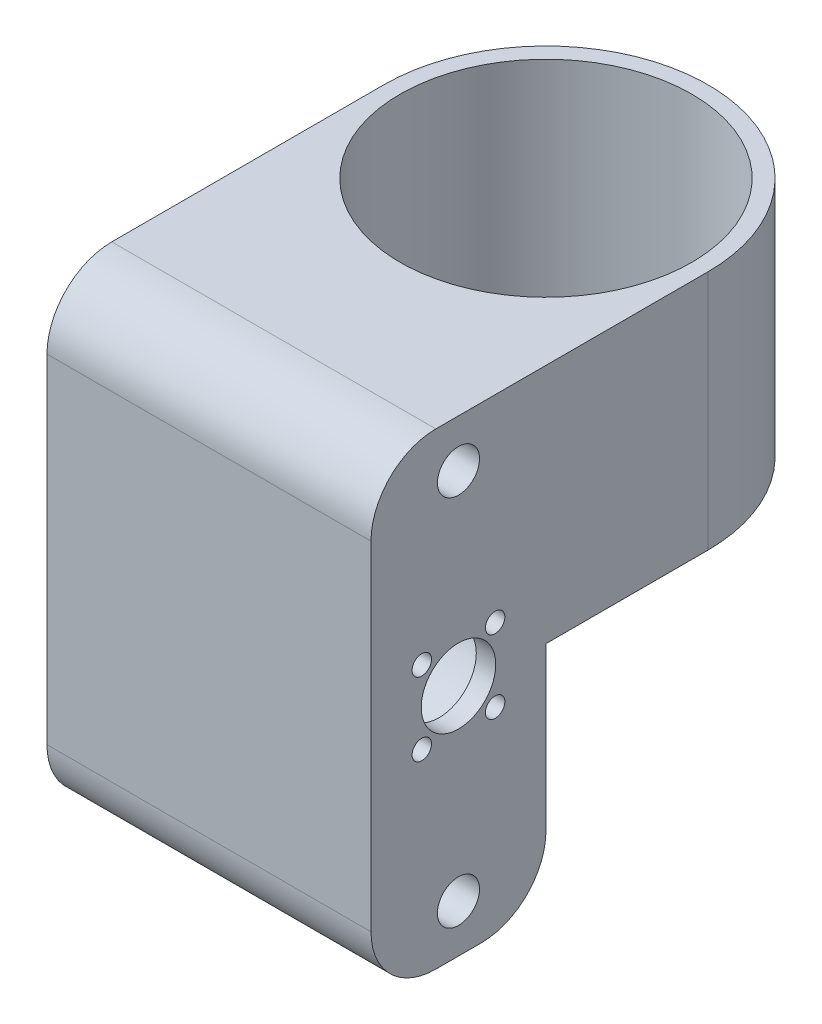
ISO-10303-21;
HEADER;
FILE_DESCRIPTION(('STEP AP214'),'2;1');
FILE_NAME('part.step','',(''),(''),'','','');
FILE_SCHEMA(('AUTOMOTIVE_DESIGN { 1 0 10303 214 1 1 1 1 }'));
ENDSEC;
DATA;
#1=APPLICATION_CONTEXT('core data for automotive mechanical design processes');
#2=APPLICATION_PROTOCOL_DEFINITION('international standard','automotive_design',2000,#1);
#3=PRODUCT_CONTEXT('',#1,'mechanical');
#4=PRODUCT('Part','Part','',(#3));
#5=PRODUCT_RELATED_PRODUCT_CATEGORY('part','',(#4));
#6=PRODUCT_DEFINITION_FORMATION('','',#4);
#7=PRODUCT_DEFINITION_CONTEXT('part definition',#1,'design');
#8=PRODUCT_DEFINITION('design','',#6,#7);
#9=PRODUCT_DEFINITION_SHAPE('','',#8);
#10=(LENGTH_UNIT() NAMED_UNIT(*) SI_UNIT(.MILLI.,.METRE.));
#11=(NAMED_UNIT(*) PLANE_ANGLE_UNIT() SI_UNIT($,.RADIAN.));
#12=(NAMED_UNIT(*) SI_UNIT($,.STERADIAN.) SOLID_ANGLE_UNIT());
#13=UNCERTAINTY_MEASURE_WITH_UNIT(LENGTH_MEASURE(1.E-05),#10,'distance_accuracy_value','');
#14=(GEOMETRIC_REPRESENTATION_CONTEXT(3) GLOBAL_UNCERTAINTY_ASSIGNED_CONTEXT((#13)) GLOBAL_UNIT_ASSIGNED_CONTEXT((#10,
#11,#12)) REPRESENTATION_CONTEXT('',''));
#15=CARTESIAN_POINT('',(0.,0.,0.));
#16=DIRECTION('',(0.,0.,1.));
#17=DIRECTION('',(1.,0.,0.));
#18=AXIS2_PLACEMENT_3D('',#15,#16,#17);
#19=CARTESIAN_POINT('',(25.,99.7396103067893,-38.5));
#20=DIRECTION('',(0.,-1.,0.));
#21=DIRECTION('',(0.,0.,-1.));
#22=AXIS2_PLACEMENT_3D('',#19,#20,#21);
#23=CYLINDRICAL_SURFACE('',#22,22.5);
#24=CARTESIAN_POINT('',(25.,36.1,-38.5));
#25=DIRECTION('',(0.,-1.,0.));
#26=DIRECTION('',(0.,0.,-1.));
#27=AXIS2_PLACEMENT_3D('',#24,#25,#26);
#28=CIRCLE('',#27,22.5);
#29=CARTESIAN_POINT('',(25.,36.1,-61.));
#30=VERTEX_POINT('',#29);
#31=EDGE_CURVE('E244',#30,#30,#28,.F.);
#32=CARTESIAN_POINT('',(25.,3.9,-38.5));
#33=DIRECTION('',(0.,-1.,0.));
#34=DIRECTION('',(0.,0.,-1.));
#35=AXIS2_PLACEMENT_3D('',#32,#33,#34);
#36=CIRCLE('',#35,22.5);
#37=CARTESIAN_POINT('',(25.,3.9,-61.));
#38=VERTEX_POINT('',#37);
#39=EDGE_CURVE('E180',#38,#38,#36,.F.);
#40=CARTESIAN_POINT('',(25.,36.1,-61.));
#41=CARTESIAN_POINT('',(25.,35.7645833333333,-61.));
#42=CARTESIAN_POINT('',(25.,35.4291666666667,-61.));
#43=CARTESIAN_POINT('',(25.,34.7583333333333,-61.));
#44=CARTESIAN_POINT('',(25.,34.4229166666667,-61.));
#45=CARTESIAN_POINT('',(25.,33.7520833333333,-61.));
#46=CARTESIAN_POINT('',(25.,33.4166666666667,-61.));
#47=CARTESIAN_POINT('',(25.,32.7458333333333,-61.));
#48=CARTESIAN_POINT('',(25.,32.4104166666667,-61.));
#49=CARTESIAN_POINT('',(25.,31.7395833333333,-61.));
#50=CARTESIAN_POINT('',(25.,31.4041666666667,-61.));
#51=CARTESIAN_POINT('',(25.,30.7333333333333,-61.));
#52=CARTESIAN_POINT('',(25.,30.3979166666667,-61.));
#53=CARTESIAN_POINT('',(25.,29.7270833333333,-61.));
#54=CARTESIAN_POINT('',(25.,29.3916666666667,-61.));
#55=CARTESIAN_POINT('',(25.,28.7208333333333,-61.));
#56=CARTESIAN_POINT('',(25.,28.3854166666667,-61.));
#57=CARTESIAN_POINT('',(25.,27.7145833333333,-61.));
#58=CARTESIAN_POINT('',(25.,27.3791666666667,-61.));
#59=CARTESIAN_POINT('',(25.,26.7083333333333,-61.));
#60=CARTESIAN_POINT('',(25.,26.3729166666667,-61.));
#61=CARTESIAN_POINT('',(25.,25.7020833333333,-61.));
#62=CARTESIAN_POINT('',(25.,25.3666666666667,-61.));
#63=CARTESIAN_POINT('',(25.,24.6958333333333,-61.));
#64=CARTESIAN_POINT('',(25.,24.3604166666667,-61.));
#65=CARTESIAN_POINT('',(25.,23.6895833333333,-61.));
#66=CARTESIAN_POINT('',(25.,23.3541666666667,-61.));
#67=CARTESIAN_POINT('',(25.,22.6833333333333,-61.));
#68=CARTESIAN_POINT('',(25.,22.3479166666667,-61.));
#69=CARTESIAN_POINT('',(25.,21.6770833333333,-61.));
#70=CARTESIAN_POINT('',(25.,21.3416666666667,-61.));
#71=CARTESIAN_POINT('',(25.,20.6708333333333,-61.));
#72=CARTESIAN_POINT('',(25.,20.3354166666667,-61.));
#73=CARTESIAN_POINT('',(25.,19.6645833333333,-61.));
#74=CARTESIAN_POINT('',(25.,19.3291666666667,-61.));
#75=CARTESIAN_POINT('',(25.,18.6583333333333,-61.));
#76=CARTESIAN_POINT('',(25.,18.3229166666667,-61.));
#77=CARTESIAN_POINT('',(25.,17.6520833333333,-61.));
#78=CARTESIAN_POINT('',(25.,17.3166666666667,-61.));
#79=CARTESIAN_POINT('',(25.,16.6458333333333,-61.));
#80=CARTESIAN_POINT('',(25.,16.3104166666667,-61.));
#81=CARTESIAN_POINT('',(25.,15.6395833333333,-61.));
#82=CARTESIAN_POINT('',(25.,15.3041666666667,-61.));
#83=CARTESIAN_POINT('',(25.,14.6333333333333,-61.));
#84=CARTESIAN_POINT('',(25.,14.2979166666667,-61.));
#85=CARTESIAN_POINT('',(25.,13.6270833333333,-61.));
#86=CARTESIAN_POINT('',(25.,13.2916666666667,-61.));
#87=CARTESIAN_POINT('',(25.,12.6208333333333,-61.));
#88=CARTESIAN_POINT('',(25.,12.2854166666667,-61.));
#89=CARTESIAN_POINT('',(25.,11.6145833333333,-61.));
#90=CARTESIAN_POINT('',(25.,11.2791666666667,-61.));
#91=CARTESIAN_POINT('',(25.,10.6083333333333,-61.));
#92=CARTESIAN_POINT('',(25.,10.2729166666667,-61.));
#93=CARTESIAN_POINT('',(25.,9.60208333333334,-61.));
#94=CARTESIAN_POINT('',(25.,9.26666666666667,-61.));
#95=CARTESIAN_POINT('',(25.,8.59583333333333,-61.));
#96=CARTESIAN_POINT('',(25.,8.26041666666667,-61.));
#97=CARTESIAN_POINT('',(25.,7.58958333333333,-61.));
#98=CARTESIAN_POINT('',(25.,7.25416666666667,-61.));
#99=CARTESIAN_POINT('',(25.,6.58333333333333,-61.));
#100=CARTESIAN_POINT('',(25.,6.24791666666667,-61.));
#101=CARTESIAN_POINT('',(25.,5.57708333333333,-61.));
#102=CARTESIAN_POINT('',(25.,5.24166666666667,-61.));
#103=CARTESIAN_POINT('',(25.,4.57083333333333,-61.));
#104=CARTESIAN_POINT('',(25.,4.23541666666667,-61.));
#105=CARTESIAN_POINT('',(25.,3.9,-61.));
#106=B_SPLINE_CURVE_WITH_KNOTS('',3,(#40,#41,#42,#43,#44,#45,#46,#47,#48,#49,#50,#51,#52,#53,
#54,#55,#56,#57,#58,#59,#60,#61,#62,#63,#64,#65,#66,#67,#68,#69,#70,#71,#72,#73,#74,#75,#76,#77,
#78,#79,#80,#81,#82,#83,#84,#85,#86,#87,#88,#89,#90,#91,#92,#93,#94,#95,#96,#97,#98,#99,#100,
#101,#102,#103,#104,#105),.UNSPECIFIED.,.F.,.F.,(4,2,2,2,2,2,2,2,2,2,2,2,2,2,2,2,2,2,2,2,2,2,2,
2,2,2,2,2,2,2,2,2,4),(0.,1.00625,2.0125,3.01875,4.025,5.03125,6.0375,7.04375,8.05,9.05625,
10.0625,11.06875,12.075,13.08125,14.0875,15.09375,16.1,17.10625,18.1125,19.11875,20.125,
21.13125,22.1375,23.14375,24.15,25.15625,26.1625,27.16875,28.175,29.18125,30.1875,31.19375,
32.2),.UNSPECIFIED.);
#107=EDGE_CURVE('BSEAM43',#30,#38,#106,.T.);
#108=ORIENTED_EDGE('',*,*,#31,.T.);
#109=ORIENTED_EDGE('',*,*,#39,.F.);
#110=ORIENTED_EDGE('',*,*,#107,.T.);
#111=ORIENTED_EDGE('',*,*,#107,.F.);
#112=EDGE_LOOP('',(#108,#110,#109,#111));
#113=FACE_BOUND('',#112,.T.);
#114=ADVANCED_FACE('F43',(#113),#23,.F.);
#115=CARTESIAN_POINT('',(50.,-36.1,0.));
#116=DIRECTION('',(0.,-1.,0.));
#117=DIRECTION('',(0.,0.,-1.));
#118=AXIS2_PLACEMENT_3D('',#115,#116,#117);
#119=PLANE('',#118);
#120=DIRECTION('',(0.,0.,1.));
#121=VECTOR('',#120,1.);
#122=CARTESIAN_POINT('',(0.,-36.1,0.));
#123=LINE('',#122,#121);
#124=CARTESIAN_POINT('',(0.,-36.1,-3.5));
#125=VERTEX_POINT('',#124);
#126=CARTESIAN_POINT('',(0.,-36.1,3.5));
#127=VERTEX_POINT('',#126);
#128=EDGE_CURVE('E189',#125,#127,#123,.T.);
#129=ORIENTED_EDGE('',*,*,#128,.F.);
#130=DIRECTION('',(1.,0.,0.));
#131=VECTOR('',#130,1.);
#132=CARTESIAN_POINT('',(50.,-36.1,-3.5));
#133=LINE('',#132,#131);
#134=CARTESIAN_POINT('',(50.,-36.1,-3.5));
#135=VERTEX_POINT('',#134);
#136=EDGE_CURVE('E198',#125,#135,#133,.T.);
#137=ORIENTED_EDGE('',*,*,#136,.T.);
#138=DIRECTION('',(0.,0.,1.));
#139=VECTOR('',#138,1.);
#140=CARTESIAN_POINT('',(50.,-36.1,0.));
#141=LINE('',#140,#139);
#142=CARTESIAN_POINT('',(50.,-36.1,3.5));
#143=VERTEX_POINT('',#142);
#144=EDGE_CURVE('E160',#135,#143,#141,.T.);
#145=ORIENTED_EDGE('',*,*,#144,.T.);
#146=DIRECTION('',(-1.,0.,0.));
#147=VECTOR('',#146,1.);
#148=CARTESIAN_POINT('',(50.,-36.1,3.5));
#149=LINE('',#148,#147);
#150=EDGE_CURVE('E195',#143,#127,#149,.T.);
#151=ORIENTED_EDGE('',*,*,#150,.T.);
#152=EDGE_LOOP('',(#129,#137,#145,#151));
#153=FACE_BOUND('',#152,.T.);
#154=ADVANCED_FACE('F227',(#153),#119,.T.);
#155=CARTESIAN_POINT('',(50.,0.,0.));
#156=DIRECTION('',(1.,0.,0.));
#157=DIRECTION('',(0.,0.,-1.));
#158=AXIS2_PLACEMENT_3D('',#155,#156,#157);
#159=PLANE('',#158);
#160=CARTESIAN_POINT('',(50.,-28.75,0.));
#161=DIRECTION('',(1.,0.,0.));
#162=DIRECTION('',(0.,0.,-1.));
#163=AXIS2_PLACEMENT_3D('',#160,#161,#162);
#164=CIRCLE('',#163,3.25);
#165=CARTESIAN_POINT('',(50.,-28.75,-3.25000000000001));
#166=VERTEX_POINT('',#165);
#167=EDGE_CURVE('E150',#166,#166,#164,.T.);
#168=ORIENTED_EDGE('',*,*,#167,.F.);
#169=EDGE_LOOP('',(#168));
#170=FACE_BOUND('',#169,.T.);
#171=CARTESIAN_POINT('',(50.,28.75,0.));
#172=DIRECTION('',(1.,0.,0.));
#173=DIRECTION('',(0.,0.,-1.));
#174=AXIS2_PLACEMENT_3D('',#171,#172,#173);
#175=CIRCLE('',#174,3.25);
#176=CARTESIAN_POINT('',(50.,28.75,-3.25));
#177=VERTEX_POINT('',#176);
#178=EDGE_CURVE('E153',#177,#177,#175,.T.);
#179=ORIENTED_EDGE('',*,*,#178,.F.);
#180=EDGE_LOOP('',(#179));
#181=FACE_BOUND('',#180,.T.);
#182=CARTESIAN_POINT('',(50.,0.,0.));
#183=DIRECTION('',(1.,0.,0.));
#184=DIRECTION('',(0.,0.,-1.));
#185=AXIS2_PLACEMENT_3D('',#182,#183,#184);
#186=CIRCLE('',#185,5.75);
#187=CARTESIAN_POINT('',(50.,0.,-5.75));
#188=VERTEX_POINT('',#187);
#189=EDGE_CURVE('E165',#188,#188,#186,.T.);
#190=ORIENTED_EDGE('',*,*,#189,.F.);
#191=EDGE_LOOP('',(#190));
#192=FACE_BOUND('',#191,.T.);
#193=CARTESIAN_POINT('',(50.,5.65685424949238,5.65685424949238));
#194=DIRECTION('',(1.,0.,0.));
#195=DIRECTION('',(0.,0.,-1.));
#196=AXIS2_PLACEMENT_3D('',#193,#194,#195);
#197=CIRCLE('',#196,1.5);
#198=CARTESIAN_POINT('',(50.,5.65685424949238,4.15685424949238));
#199=VERTEX_POINT('',#198);
#200=EDGE_CURVE('E168',#199,#199,#197,.T.);
#201=ORIENTED_EDGE('',*,*,#200,.F.);
#202=EDGE_LOOP('',(#201));
#203=FACE_BOUND('',#202,.T.);
#204=CARTESIAN_POINT('',(50.,5.65685424949238,-5.65685424949238));
#205=DIRECTION('',(1.,0.,0.));
#206=DIRECTION('',(0.,0.,-1.));
#207=AXIS2_PLACEMENT_3D('',#204,#205,#206);
#208=CIRCLE('',#207,1.5);
#209=CARTESIAN_POINT('',(50.,5.65685424949238,-7.15685424949238));
#210=VERTEX_POINT('',#209);
#211=EDGE_CURVE('E171',#210,#210,#208,.T.);
#212=ORIENTED_EDGE('',*,*,#211,.F.);
#213=EDGE_LOOP('',(#212));
#214=FACE_BOUND('',#213,.T.);
#215=CARTESIAN_POINT('',(50.,-5.65685424949238,-5.65685424949238));
#216=DIRECTION('',(1.,0.,0.));
#217=DIRECTION('',(0.,0.,-1.));
#218=AXIS2_PLACEMENT_3D('',#215,#216,#217);
#219=CIRCLE('',#218,1.5);
#220=CARTESIAN_POINT('',(50.,-5.65685424949238,-7.15685424949238));
#221=VERTEX_POINT('',#220);
#222=EDGE_CURVE('E174',#221,#221,#219,.T.);
#223=ORIENTED_EDGE('',*,*,#222,.F.);
#224=EDGE_LOOP('',(#223));
#225=FACE_BOUND('',#224,.T.);
#226=CARTESIAN_POINT('',(50.,-5.65685424949238,5.65685424949238));
#227=DIRECTION('',(1.,0.,0.));
#228=DIRECTION('',(0.,0.,-1.));
#229=AXIS2_PLACEMENT_3D('',#226,#227,#228);
#230=CIRCLE('',#229,1.5);
#231=CARTESIAN_POINT('',(50.,-5.65685424949238,4.15685424949238));
#232=VERTEX_POINT('',#231);
#233=EDGE_CURVE('E177',#232,#232,#230,.T.);
#234=ORIENTED_EDGE('',*,*,#233,.F.);
#235=EDGE_LOOP('',(#234));
#236=FACE_BOUND('',#235,.T.);
#237=ORIENTED_EDGE('',*,*,#144,.F.);
#238=CARTESIAN_POINT('',(50.,-26.1,-3.5));
#239=DIRECTION('',(1.,0.,0.));
#240=DIRECTION('',(0.,0.,-1.));
#241=AXIS2_PLACEMENT_3D('',#238,#239,#240);
#242=CIRCLE('',#241,10.);
#243=CARTESIAN_POINT('',(50.,-26.1,-13.5));
#244=VERTEX_POINT('',#243);
#245=EDGE_CURVE('E205',#135,#244,#242,.T.);
#246=ORIENTED_EDGE('',*,*,#245,.T.);
#247=DIRECTION('',(0.,-1.,0.));
#248=VECTOR('',#247,1.);
#249=CARTESIAN_POINT('',(50.,-1.1,-13.5));
#250=LINE('',#249,#248);
#251=CARTESIAN_POINT('',(50.,-1.1,-13.5));
#252=VERTEX_POINT('',#251);
#253=EDGE_CURVE('E135',#252,#244,#250,.T.);
#254=ORIENTED_EDGE('',*,*,#253,.F.);
#255=DIRECTION('',(0.,0.,-1.));
#256=VECTOR('',#255,1.);
#257=CARTESIAN_POINT('',(50.,-1.1,0.));
#258=LINE('',#257,#256);
#259=CARTESIAN_POINT('',(50.,-1.1,-38.5));
#260=VERTEX_POINT('',#259);
#261=EDGE_CURVE('E118',#252,#260,#258,.T.);
#262=ORIENTED_EDGE('',*,*,#261,.T.);
#263=DIRECTION('',(0.,-1.,0.));
#264=VECTOR('',#263,1.);
#265=CARTESIAN_POINT('',(50.,106.810678118655,-38.5));
#266=LINE('',#265,#264);
#267=CARTESIAN_POINT('',(50.,36.1,-38.5));
#268=VERTEX_POINT('',#267);
#269=EDGE_CURVE('E133',#268,#260,#266,.T.);
#270=ORIENTED_EDGE('',*,*,#269,.F.);
#271=DIRECTION('',(0.,0.,1.));
#272=VECTOR('',#271,1.);
#273=CARTESIAN_POINT('',(50.,36.1,0.));
#274=LINE('',#273,#272);
#275=CARTESIAN_POINT('',(50.,36.1,3.5));
#276=VERTEX_POINT('',#275);
#277=EDGE_CURVE('E163',#268,#276,#274,.T.);
#278=ORIENTED_EDGE('',*,*,#277,.T.);
#279=CARTESIAN_POINT('',(50.,26.1,3.5));
#280=DIRECTION('',(1.,0.,0.));
#281=DIRECTION('',(0.,0.,-1.));
#282=AXIS2_PLACEMENT_3D('',#279,#280,#281);
#283=CIRCLE('',#282,10.);
#284=CARTESIAN_POINT('',(50.,26.1,13.5));
#285=VERTEX_POINT('',#284);
#286=EDGE_CURVE('E201',#276,#285,#283,.T.);
#287=ORIENTED_EDGE('',*,*,#286,.T.);
#288=DIRECTION('',(0.,1.,0.));
#289=VECTOR('',#288,1.);
#290=CARTESIAN_POINT('',(50.,0.,13.5));
#291=LINE('',#290,#289);
#292=CARTESIAN_POINT('',(50.,-26.1,13.5));
#293=VERTEX_POINT('',#292);
#294=EDGE_CURVE('E157',#293,#285,#291,.T.);
#295=ORIENTED_EDGE('',*,*,#294,.F.);
#296=CARTESIAN_POINT('',(50.,-26.1,3.5));
#297=DIRECTION('',(1.,0.,0.));
#298=DIRECTION('',(0.,0.,-1.));
#299=AXIS2_PLACEMENT_3D('',#296,#297,#298);
#300=CIRCLE('',#299,10.);
#301=EDGE_CURVE('E203',#293,#143,#300,.T.);
#302=ORIENTED_EDGE('',*,*,#301,.T.);
#303=EDGE_LOOP('',(#237,#246,#254,#262,#270,#278,#287,#295,#302));
#304=FACE_BOUND('',#303,.T.);
#305=ADVANCED_FACE('F131',(#170,#181,#192,#203,#214,#225,#236,#304),#159,.T.);
#306=CARTESIAN_POINT('',(0.,0.,0.));
#307=DIRECTION('',(1.,0.,0.));
#308=DIRECTION('',(0.,0.,-1.));
#309=AXIS2_PLACEMENT_3D('',#306,#307,#308);
#310=PLANE('',#309);
#311=CARTESIAN_POINT('',(0.,0.,0.));
#312=DIRECTION('',(1.,0.,0.));
#313=DIRECTION('',(0.,0.,-1.));
#314=AXIS2_PLACEMENT_3D('',#311,#312,#313);
#315=CIRCLE('',#314,11.);
#316=CARTESIAN_POINT('',(0.,0.,-11.));
#317=VERTEX_POINT('',#316);
#318=EDGE_CURVE('E256',#317,#317,#315,.T.);
#319=ORIENTED_EDGE('',*,*,#318,.T.);
#320=EDGE_LOOP('',(#319));
#321=FACE_BOUND('',#320,.T.);
#322=CARTESIAN_POINT('',(0.,28.75,0.));
#323=DIRECTION('',(1.,0.,0.));
#324=DIRECTION('',(0.,0.,-1.));
#325=AXIS2_PLACEMENT_3D('',#322,#323,#324);
#326=CIRCLE('',#325,3.25);
#327=CARTESIAN_POINT('',(0.,28.75,-3.25));
#328=VERTEX_POINT('',#327);
#329=EDGE_CURVE('E184',#328,#328,#326,.T.);
#330=ORIENTED_EDGE('',*,*,#329,.T.);
#331=EDGE_LOOP('',(#330));
#332=FACE_BOUND('',#331,.T.);
#333=CARTESIAN_POINT('',(0.,-28.75,0.));
#334=DIRECTION('',(1.,0.,0.));
#335=DIRECTION('',(0.,0.,-1.));
#336=AXIS2_PLACEMENT_3D('',#333,#334,#335);
#337=CIRCLE('',#336,3.25);
#338=CARTESIAN_POINT('',(0.,-28.75,-3.25000000000001));
#339=VERTEX_POINT('',#338);
#340=EDGE_CURVE('E181',#339,#339,#337,.T.);
#341=ORIENTED_EDGE('',*,*,#340,.T.);
#342=EDGE_LOOP('',(#341));
#343=FACE_BOUND('',#342,.T.);
#344=DIRECTION('',(0.,-1.,0.));
#345=VECTOR('',#344,1.);
#346=CARTESIAN_POINT('',(0.,-1.1,-13.5));
#347=LINE('',#346,#345);
#348=CARTESIAN_POINT('',(0.,-1.1,-13.5));
#349=VERTEX_POINT('',#348);
#350=CARTESIAN_POINT('',(0.,-26.1,-13.5));
#351=VERTEX_POINT('',#350);
#352=EDGE_CURVE('E143',#349,#351,#347,.T.);
#353=ORIENTED_EDGE('',*,*,#352,.T.);
#354=CARTESIAN_POINT('',(0.,-26.1,-3.5));
#355=DIRECTION('',(1.,0.,0.));
#356=DIRECTION('',(0.,0.,-1.));
#357=AXIS2_PLACEMENT_3D('',#354,#355,#356);
#358=CIRCLE('',#357,10.);
#359=EDGE_CURVE('E212',#351,#125,#358,.F.);
#360=ORIENTED_EDGE('',*,*,#359,.T.);
#361=ORIENTED_EDGE('',*,*,#128,.T.);
#362=CARTESIAN_POINT('',(0.,-26.1,3.5));
#363=DIRECTION('',(1.,0.,0.));
#364=DIRECTION('',(0.,0.,-1.));
#365=AXIS2_PLACEMENT_3D('',#362,#363,#364);
#366=CIRCLE('',#365,10.);
#367=CARTESIAN_POINT('',(0.,-26.1,13.5));
#368=VERTEX_POINT('',#367);
#369=EDGE_CURVE('E210',#127,#368,#366,.F.);
#370=ORIENTED_EDGE('',*,*,#369,.T.);
#371=DIRECTION('',(0.,1.,0.));
#372=VECTOR('',#371,1.);
#373=CARTESIAN_POINT('',(0.,0.,13.5));
#374=LINE('',#373,#372);
#375=CARTESIAN_POINT('',(0.,26.1,13.5));
#376=VERTEX_POINT('',#375);
#377=EDGE_CURVE('E187',#368,#376,#374,.T.);
#378=ORIENTED_EDGE('',*,*,#377,.T.);
#379=CARTESIAN_POINT('',(0.,26.1,3.5));
#380=DIRECTION('',(1.,0.,0.));
#381=DIRECTION('',(0.,0.,-1.));
#382=AXIS2_PLACEMENT_3D('',#379,#380,#381);
#383=CIRCLE('',#382,10.);
#384=CARTESIAN_POINT('',(0.,36.1,3.5));
#385=VERTEX_POINT('',#384);
#386=EDGE_CURVE('E58',#376,#385,#383,.F.);
#387=ORIENTED_EDGE('',*,*,#386,.T.);
#388=DIRECTION('',(0.,0.,1.));
#389=VECTOR('',#388,1.);
#390=CARTESIAN_POINT('',(0.,36.1,0.));
#391=LINE('',#390,#389);
#392=CARTESIAN_POINT('',(0.,36.1,-38.5));
#393=VERTEX_POINT('',#392);
#394=EDGE_CURVE('E154',#393,#385,#391,.T.);
#395=ORIENTED_EDGE('',*,*,#394,.F.);
#396=DIRECTION('',(0.,-1.,0.));
#397=VECTOR('',#396,1.);
#398=CARTESIAN_POINT('',(0.,106.810678118655,-38.5));
#399=LINE('',#398,#397);
#400=CARTESIAN_POINT('',(0.,-1.09999999999999,-38.5));
#401=VERTEX_POINT('',#400);
#402=EDGE_CURVE('E142',#393,#401,#399,.T.);
#403=ORIENTED_EDGE('',*,*,#402,.T.);
#404=DIRECTION('',(0.,0.,1.));
#405=VECTOR('',#404,1.);
#406=CARTESIAN_POINT('',(0.,-1.1,0.));
#407=LINE('',#406,#405);
#408=EDGE_CURVE('E121',#401,#349,#407,.T.);
#409=ORIENTED_EDGE('',*,*,#408,.T.);
#410=EDGE_LOOP('',(#353,#360,#361,#370,#378,#387,#395,#403,#409));
#411=FACE_BOUND('',#410,.T.);
#412=ADVANCED_FACE('F229',(#321,#332,#343,#411),#310,.F.);
#413=CARTESIAN_POINT('',(25.,106.810678118655,-38.5));
#414=DIRECTION('',(0.,-1.,0.));
#415=DIRECTION('',(0.,0.,-1.));
#416=AXIS2_PLACEMENT_3D('',#413,#414,#415);
#417=CYLINDRICAL_SURFACE('',#416,25.);
#418=CARTESIAN_POINT('',(25.,-1.1,-38.5));
#419=DIRECTION('',(0.,-1.,0.));
#420=DIRECTION('',(0.,0.,-1.));
#421=AXIS2_PLACEMENT_3D('',#418,#419,#420);
#422=CIRCLE('',#421,25.);
#423=EDGE_CURVE('E113',#260,#401,#422,.F.);
#424=ORIENTED_EDGE('',*,*,#423,.T.);
#425=ORIENTED_EDGE('',*,*,#402,.F.);
#426=CARTESIAN_POINT('',(25.,36.1,-38.5));
#427=DIRECTION('',(0.,-1.,0.));
#428=DIRECTION('',(0.,0.,-1.));
#429=AXIS2_PLACEMENT_3D('',#426,#427,#428);
#430=CIRCLE('',#429,25.);
#431=EDGE_CURVE('E141',#393,#268,#430,.T.);
#432=ORIENTED_EDGE('',*,*,#431,.T.);
#433=ORIENTED_EDGE('',*,*,#269,.T.);
#434=EDGE_LOOP('',(#424,#425,#432,#433));
#435=FACE_BOUND('',#434,.T.);
#436=ADVANCED_FACE('F139',(#435),#417,.T.);
#437=CARTESIAN_POINT('',(50.,0.,13.5));
#438=DIRECTION('',(0.,0.,1.));
#439=DIRECTION('',(0.,-1.,0.));
#440=AXIS2_PLACEMENT_3D('',#437,#438,#439);
#441=PLANE('',#440);
#442=ORIENTED_EDGE('',*,*,#377,.F.);
#443=DIRECTION('',(-1.,0.,0.));
#444=VECTOR('',#443,1.);
#445=CARTESIAN_POINT('',(50.,-26.1,13.5));
#446=LINE('',#445,#444);
#447=EDGE_CURVE('E51',#368,#293,#446,.F.);
#448=ORIENTED_EDGE('',*,*,#447,.T.);
#449=ORIENTED_EDGE('',*,*,#294,.T.);
#450=DIRECTION('',(-1.,0.,0.));
#451=VECTOR('',#450,1.);
#452=CARTESIAN_POINT('',(0.,26.1,13.5));
#453=LINE('',#452,#451);
#454=EDGE_CURVE('E214',#285,#376,#453,.T.);
#455=ORIENTED_EDGE('',*,*,#454,.T.);
#456=EDGE_LOOP('',(#442,#448,#449,#455));
#457=FACE_BOUND('',#456,.T.);
#458=ADVANCED_FACE('F219',(#457),#441,.T.);
#459=CARTESIAN_POINT('',(50.,-5.65685424949238,-5.65685424949238));
#460=DIRECTION('',(-1.,0.,0.));
#461=DIRECTION('',(0.,0.,1.));
#462=AXIS2_PLACEMENT_3D('',#459,#460,#461);
#463=CYLINDRICAL_SURFACE('',#462,1.5);
#464=CARTESIAN_POINT('',(47.,-5.65685424949238,-5.65685424949238));
#465=DIRECTION('',(1.,0.,0.));
#466=DIRECTION('',(0.,0.,-1.));
#467=AXIS2_PLACEMENT_3D('',#464,#465,#466);
#468=CIRCLE('',#467,1.5);
#469=CARTESIAN_POINT('',(47.,-5.65685424949238,-7.15685424949238));
#470=VERTEX_POINT('',#469);
#471=EDGE_CURVE('E243',#470,#470,#468,.T.);
#472=ORIENTED_EDGE('',*,*,#471,.F.);
#473=EDGE_LOOP('',(#472));
#474=FACE_BOUND('',#473,.T.);
#475=ORIENTED_EDGE('',*,*,#222,.T.);
#476=EDGE_LOOP('',(#475));
#477=FACE_BOUND('',#476,.T.);
#478=ADVANCED_FACE('F360',(#474,#477),#463,.F.);
#479=CARTESIAN_POINT('',(50.,5.65685424949238,-5.65685424949238));
#480=DIRECTION('',(-1.,0.,0.));
#481=DIRECTION('',(0.,0.,1.));
#482=AXIS2_PLACEMENT_3D('',#479,#480,#481);
#483=CYLINDRICAL_SURFACE('',#482,1.5);
#484=CARTESIAN_POINT('',(47.,5.65685424949238,-5.65685424949238));
#485=DIRECTION('',(1.,0.,0.));
#486=DIRECTION('',(0.,0.,-1.));
#487=AXIS2_PLACEMENT_3D('',#484,#485,#486);
#488=CIRCLE('',#487,1.5);
#489=CARTESIAN_POINT('',(47.,5.65685424949238,-7.15685424949238));
#490=VERTEX_POINT('',#489);
#491=EDGE_CURVE('E247',#490,#490,#488,.T.);
#492=ORIENTED_EDGE('',*,*,#491,.F.);
#493=EDGE_LOOP('',(#492));
#494=FACE_BOUND('',#493,.T.);
#495=ORIENTED_EDGE('',*,*,#211,.T.);
#496=EDGE_LOOP('',(#495));
#497=FACE_BOUND('',#496,.T.);
#498=ADVANCED_FACE('F363',(#494,#497),#483,.F.);
#499=CARTESIAN_POINT('',(50.,5.65685424949238,5.65685424949238));
#500=DIRECTION('',(-1.,0.,0.));
#501=DIRECTION('',(0.,0.,1.));
#502=AXIS2_PLACEMENT_3D('',#499,#500,#501);
#503=CYLINDRICAL_SURFACE('',#502,1.5);
#504=CARTESIAN_POINT('',(47.,5.65685424949238,5.65685424949238));
#505=DIRECTION('',(1.,0.,0.));
#506=DIRECTION('',(0.,0.,-1.));
#507=AXIS2_PLACEMENT_3D('',#504,#505,#506);
#508=CIRCLE('',#507,1.5);
#509=CARTESIAN_POINT('',(47.,5.65685424949238,4.15685424949238));
#510=VERTEX_POINT('',#509);
#511=EDGE_CURVE('E250',#510,#510,#508,.T.);
#512=ORIENTED_EDGE('',*,*,#511,.F.);
#513=EDGE_LOOP('',(#512));
#514=FACE_BOUND('',#513,.T.);
#515=ORIENTED_EDGE('',*,*,#200,.T.);
#516=EDGE_LOOP('',(#515));
#517=FACE_BOUND('',#516,.T.);
#518=ADVANCED_FACE('F367',(#514,#517),#503,.F.);
#519=CARTESIAN_POINT('',(50.,0.,0.));
#520=DIRECTION('',(-1.,0.,0.));
#521=DIRECTION('',(0.,0.,1.));
#522=AXIS2_PLACEMENT_3D('',#519,#520,#521);
#523=CYLINDRICAL_SURFACE('',#522,5.75);
#524=CARTESIAN_POINT('',(47.,0.,0.));
#525=DIRECTION('',(1.,0.,0.));
#526=DIRECTION('',(0.,0.,-1.));
#527=AXIS2_PLACEMENT_3D('',#524,#525,#526);
#528=CIRCLE('',#527,5.75);
#529=CARTESIAN_POINT('',(47.,0.,-5.75));
#530=VERTEX_POINT('',#529);
#531=EDGE_CURVE('E253',#530,#530,#528,.T.);
#532=ORIENTED_EDGE('',*,*,#531,.F.);
#533=EDGE_LOOP('',(#532));
#534=FACE_BOUND('',#533,.T.);
#535=ORIENTED_EDGE('',*,*,#189,.T.);
#536=EDGE_LOOP('',(#535));
#537=FACE_BOUND('',#536,.T.);
#538=ADVANCED_FACE('F371',(#534,#537),#523,.F.);
#539=CARTESIAN_POINT('',(50.,36.1,0.));
#540=DIRECTION('',(0.,-1.,0.));
#541=DIRECTION('',(0.,0.,-1.));
#542=AXIS2_PLACEMENT_3D('',#539,#540,#541);
#543=PLANE('',#542);
#544=ORIENTED_EDGE('',*,*,#31,.F.);
#545=EDGE_LOOP('',(#544));
#546=FACE_BOUND('',#545,.T.);
#547=ORIENTED_EDGE('',*,*,#394,.T.);
#548=DIRECTION('',(-1.,0.,0.));
#549=VECTOR('',#548,1.);
#550=CARTESIAN_POINT('',(50.,36.1,3.5));
#551=LINE('',#550,#549);
#552=EDGE_CURVE('E12',#385,#276,#551,.F.);
#553=ORIENTED_EDGE('',*,*,#552,.T.);
#554=ORIENTED_EDGE('',*,*,#277,.F.);
#555=ORIENTED_EDGE('',*,*,#431,.F.);
#556=EDGE_LOOP('',(#547,#553,#554,#555));
#557=FACE_BOUND('',#556,.T.);
#558=ADVANCED_FACE('F375',(#546,#557),#543,.F.);
#559=CARTESIAN_POINT('',(50.,28.75,0.));
#560=DIRECTION('',(-1.,0.,0.));
#561=DIRECTION('',(0.,0.,1.));
#562=AXIS2_PLACEMENT_3D('',#559,#560,#561);
#563=CYLINDRICAL_SURFACE('',#562,3.25);
#564=ORIENTED_EDGE('',*,*,#178,.T.);
#565=EDGE_LOOP('',(#564));
#566=FACE_BOUND('',#565,.T.);
#567=ORIENTED_EDGE('',*,*,#329,.F.);
#568=EDGE_LOOP('',(#567));
#569=FACE_BOUND('',#568,.T.);
#570=ADVANCED_FACE('F378',(#566,#569),#563,.F.);
#571=CARTESIAN_POINT('',(50.,-28.75,0.));
#572=DIRECTION('',(-1.,0.,0.));
#573=DIRECTION('',(0.,0.,1.));
#574=AXIS2_PLACEMENT_3D('',#571,#572,#573);
#575=CYLINDRICAL_SURFACE('',#574,3.25);
#576=ORIENTED_EDGE('',*,*,#167,.T.);
#577=EDGE_LOOP('',(#576));
#578=FACE_BOUND('',#577,.T.);
#579=ORIENTED_EDGE('',*,*,#340,.F.);
#580=EDGE_LOOP('',(#579));
#581=FACE_BOUND('',#580,.T.);
#582=ADVANCED_FACE('F358',(#578,#581),#575,.F.);
#583=CARTESIAN_POINT('',(50.,-5.65685424949238,5.65685424949238));
#584=DIRECTION('',(-1.,0.,0.));
#585=DIRECTION('',(0.,0.,1.));
#586=AXIS2_PLACEMENT_3D('',#583,#584,#585);
#587=CYLINDRICAL_SURFACE('',#586,1.5);
#588=CARTESIAN_POINT('',(47.,-5.65685424949238,5.65685424949238));
#589=DIRECTION('',(1.,0.,0.));
#590=DIRECTION('',(0.,0.,-1.));
#591=AXIS2_PLACEMENT_3D('',#588,#589,#590);
#592=CIRCLE('',#591,1.5);
#593=CARTESIAN_POINT('',(47.,-5.65685424949238,4.15685424949238));
#594=VERTEX_POINT('',#593);
#595=EDGE_CURVE('E240',#594,#594,#592,.T.);
#596=ORIENTED_EDGE('',*,*,#595,.F.);
#597=EDGE_LOOP('',(#596));
#598=FACE_BOUND('',#597,.T.);
#599=ORIENTED_EDGE('',*,*,#233,.T.);
#600=EDGE_LOOP('',(#599));
#601=FACE_BOUND('',#600,.T.);
#602=ADVANCED_FACE('F347',(#598,#601),#587,.F.);
#603=CARTESIAN_POINT('',(0.,-1.1,-13.5));
#604=DIRECTION('',(0.,0.,-1.));
#605=DIRECTION('',(-1.,0.,0.));
#606=AXIS2_PLACEMENT_3D('',#603,#604,#605);
#607=PLANE('',#606);
#608=ORIENTED_EDGE('',*,*,#253,.T.);
#609=DIRECTION('',(1.,0.,0.));
#610=VECTOR('',#609,1.);
#611=CARTESIAN_POINT('',(0.,-26.1,-13.5));
#612=LINE('',#611,#610);
#613=EDGE_CURVE('E207',#244,#351,#612,.F.);
#614=ORIENTED_EDGE('',*,*,#613,.T.);
#615=ORIENTED_EDGE('',*,*,#352,.F.);
#616=DIRECTION('',(1.,0.,0.));
#617=VECTOR('',#616,1.);
#618=CARTESIAN_POINT('',(0.,-1.1,-13.5));
#619=LINE('',#618,#617);
#620=EDGE_CURVE('E136',#349,#252,#619,.T.);
#621=ORIENTED_EDGE('',*,*,#620,.T.);
#622=EDGE_LOOP('',(#608,#614,#615,#621));
#623=FACE_BOUND('',#622,.T.);
#624=ADVANCED_FACE('F235',(#623),#607,.T.);
#625=CARTESIAN_POINT('',(0.,-1.1,0.));
#626=DIRECTION('',(0.,-1.,0.));
#627=DIRECTION('',(0.,0.,-1.));
#628=AXIS2_PLACEMENT_3D('',#625,#626,#627);
#629=PLANE('',#628);
#630=ORIENTED_EDGE('',*,*,#423,.F.);
#631=ORIENTED_EDGE('',*,*,#261,.F.);
#632=ORIENTED_EDGE('',*,*,#620,.F.);
#633=ORIENTED_EDGE('',*,*,#408,.F.);
#634=EDGE_LOOP('',(#630,#631,#632,#633));
#635=FACE_BOUND('',#634,.T.);
#636=CARTESIAN_POINT('',(25.,-1.1,-38.5));
#637=DIRECTION('',(0.,-1.,0.));
#638=DIRECTION('',(0.,0.,-1.));
#639=AXIS2_PLACEMENT_3D('',#636,#637,#638);
#640=CIRCLE('',#639,10.);
#641=CARTESIAN_POINT('',(25.,-1.1,-48.5));
#642=VERTEX_POINT('',#641);
#643=EDGE_CURVE('E288',#642,#642,#640,.T.);
#644=ORIENTED_EDGE('',*,*,#643,.F.);
#645=EDGE_LOOP('',(#644));
#646=FACE_BOUND('',#645,.T.);
#647=CARTESIAN_POINT('',(15.,-1.1,-48.5));
#648=DIRECTION('',(0.,-1.,0.));
#649=DIRECTION('',(0.,0.,-1.));
#650=AXIS2_PLACEMENT_3D('',#647,#648,#649);
#651=CIRCLE('',#650,2.00000000000001);
#652=CARTESIAN_POINT('',(15.,-1.1,-50.5));
#653=VERTEX_POINT('',#652);
#654=EDGE_CURVE('E282',#653,#653,#651,.T.);
#655=ORIENTED_EDGE('',*,*,#654,.F.);
#656=EDGE_LOOP('',(#655));
#657=FACE_BOUND('',#656,.T.);
#658=CARTESIAN_POINT('',(35.,-1.1,-48.5));
#659=DIRECTION('',(0.,-1.,0.));
#660=DIRECTION('',(0.,0.,-1.));
#661=AXIS2_PLACEMENT_3D('',#658,#659,#660);
#662=CIRCLE('',#661,2.);
#663=CARTESIAN_POINT('',(35.,-1.1,-50.5));
#664=VERTEX_POINT('',#663);
#665=EDGE_CURVE('E276',#664,#664,#662,.T.);
#666=ORIENTED_EDGE('',*,*,#665,.F.);
#667=EDGE_LOOP('',(#666));
#668=FACE_BOUND('',#667,.T.);
#669=CARTESIAN_POINT('',(35.,-1.1,-28.5));
#670=DIRECTION('',(0.,-1.,0.));
#671=DIRECTION('',(0.,0.,-1.));
#672=AXIS2_PLACEMENT_3D('',#669,#670,#671);
#673=CIRCLE('',#672,2.);
#674=CARTESIAN_POINT('',(35.,-1.1,-30.5));
#675=VERTEX_POINT('',#674);
#676=EDGE_CURVE('E270',#675,#675,#673,.T.);
#677=ORIENTED_EDGE('',*,*,#676,.F.);
#678=EDGE_LOOP('',(#677));
#679=FACE_BOUND('',#678,.T.);
#680=CARTESIAN_POINT('',(15.,-1.1,-28.5));
#681=DIRECTION('',(0.,-1.,0.));
#682=DIRECTION('',(0.,0.,-1.));
#683=AXIS2_PLACEMENT_3D('',#680,#681,#682);
#684=CIRCLE('',#683,2.00000000000001);
#685=CARTESIAN_POINT('',(15.,-1.1,-30.5));
#686=VERTEX_POINT('',#685);
#687=EDGE_CURVE('E264',#686,#686,#684,.T.);
#688=ORIENTED_EDGE('',*,*,#687,.F.);
#689=EDGE_LOOP('',(#688));
#690=FACE_BOUND('',#689,.T.);
#691=ADVANCED_FACE('F115',(#635,#646,#657,#668,#679,#690),#629,.T.);
#692=CARTESIAN_POINT('',(81.1126983722081,0.,0.));
#693=DIRECTION('',(-1.,0.,0.));
#694=DIRECTION('',(0.,0.,1.));
#695=AXIS2_PLACEMENT_3D('',#692,#693,#694);
#696=CYLINDRICAL_SURFACE('',#695,11.);
#697=ORIENTED_EDGE('',*,*,#318,.F.);
#698=EDGE_LOOP('',(#697));
#699=FACE_BOUND('',#698,.T.);
#700=CARTESIAN_POINT('',(47.,0.,0.));
#701=DIRECTION('',(1.,0.,0.));
#702=DIRECTION('',(0.,0.,-1.));
#703=AXIS2_PLACEMENT_3D('',#700,#701,#702);
#704=CIRCLE('',#703,11.);
#705=CARTESIAN_POINT('',(47.,0.,-11.));
#706=VERTEX_POINT('',#705);
#707=EDGE_CURVE('E126',#706,#706,#704,.T.);
#708=ORIENTED_EDGE('',*,*,#707,.T.);
#709=EDGE_LOOP('',(#708));
#710=FACE_BOUND('',#709,.T.);
#711=ADVANCED_FACE('F305',(#699,#710),#696,.F.);
#712=CARTESIAN_POINT('',(47.,0.,0.));
#713=DIRECTION('',(1.,0.,0.));
#714=DIRECTION('',(0.,0.,-1.));
#715=AXIS2_PLACEMENT_3D('',#712,#713,#714);
#716=PLANE('',#715);
#717=ORIENTED_EDGE('',*,*,#595,.T.);
#718=EDGE_LOOP('',(#717));
#719=FACE_BOUND('',#718,.T.);
#720=ORIENTED_EDGE('',*,*,#471,.T.);
#721=EDGE_LOOP('',(#720));
#722=FACE_BOUND('',#721,.T.);
#723=ORIENTED_EDGE('',*,*,#491,.T.);
#724=EDGE_LOOP('',(#723));
#725=FACE_BOUND('',#724,.T.);
#726=ORIENTED_EDGE('',*,*,#511,.T.);
#727=EDGE_LOOP('',(#726));
#728=FACE_BOUND('',#727,.T.);
#729=ORIENTED_EDGE('',*,*,#531,.T.);
#730=EDGE_LOOP('',(#729));
#731=FACE_BOUND('',#730,.T.);
#732=ORIENTED_EDGE('',*,*,#707,.F.);
#733=EDGE_LOOP('',(#732));
#734=FACE_BOUND('',#733,.T.);
#735=ADVANCED_FACE('F327',(#719,#722,#725,#728,#731,#734),#716,.F.);
#736=CARTESIAN_POINT('',(25.,3.9,-38.5));
#737=DIRECTION('',(0.,-1.,0.));
#738=DIRECTION('',(0.,0.,-1.));
#739=AXIS2_PLACEMENT_3D('',#736,#737,#738);
#740=PLANE('',#739);
#741=CARTESIAN_POINT('',(25.,3.9,-38.5));
#742=DIRECTION('',(0.,-1.,0.));
#743=DIRECTION('',(0.,0.,-1.));
#744=AXIS2_PLACEMENT_3D('',#741,#742,#743);
#745=CIRCLE('',#744,10.);
#746=CARTESIAN_POINT('',(25.,3.9,-48.5));
#747=VERTEX_POINT('',#746);
#748=EDGE_CURVE('E285',#747,#747,#745,.T.);
#749=ORIENTED_EDGE('',*,*,#748,.T.);
#750=EDGE_LOOP('',(#749));
#751=FACE_BOUND('',#750,.T.);
#752=CARTESIAN_POINT('',(15.,3.9,-48.5));
#753=DIRECTION('',(0.,-1.,0.));
#754=DIRECTION('',(0.,0.,-1.));
#755=AXIS2_PLACEMENT_3D('',#752,#753,#754);
#756=CIRCLE('',#755,2.00000000000001);
#757=CARTESIAN_POINT('',(15.,3.9,-50.5));
#758=VERTEX_POINT('',#757);
#759=EDGE_CURVE('E279',#758,#758,#756,.T.);
#760=ORIENTED_EDGE('',*,*,#759,.T.);
#761=EDGE_LOOP('',(#760));
#762=FACE_BOUND('',#761,.T.);
#763=CARTESIAN_POINT('',(35.,3.9,-48.5));
#764=DIRECTION('',(0.,-1.,0.));
#765=DIRECTION('',(0.,0.,-1.));
#766=AXIS2_PLACEMENT_3D('',#763,#764,#765);
#767=CIRCLE('',#766,2.);
#768=CARTESIAN_POINT('',(35.,3.9,-50.5));
#769=VERTEX_POINT('',#768);
#770=EDGE_CURVE('E273',#769,#769,#767,.T.);
#771=ORIENTED_EDGE('',*,*,#770,.T.);
#772=EDGE_LOOP('',(#771));
#773=FACE_BOUND('',#772,.T.);
#774=CARTESIAN_POINT('',(35.,3.9,-28.5));
#775=DIRECTION('',(0.,-1.,0.));
#776=DIRECTION('',(0.,0.,-1.));
#777=AXIS2_PLACEMENT_3D('',#774,#775,#776);
#778=CIRCLE('',#777,2.);
#779=CARTESIAN_POINT('',(35.,3.9,-30.5));
#780=VERTEX_POINT('',#779);
#781=EDGE_CURVE('E267',#780,#780,#778,.T.);
#782=ORIENTED_EDGE('',*,*,#781,.T.);
#783=EDGE_LOOP('',(#782));
#784=FACE_BOUND('',#783,.T.);
#785=CARTESIAN_POINT('',(15.,3.9,-28.5));
#786=DIRECTION('',(0.,-1.,0.));
#787=DIRECTION('',(0.,0.,-1.));
#788=AXIS2_PLACEMENT_3D('',#785,#786,#787);
#789=CIRCLE('',#788,2.00000000000001);
#790=CARTESIAN_POINT('',(15.,3.9,-30.5));
#791=VERTEX_POINT('',#790);
#792=EDGE_CURVE('E263',#791,#791,#789,.T.);
#793=ORIENTED_EDGE('',*,*,#792,.T.);
#794=EDGE_LOOP('',(#793));
#795=FACE_BOUND('',#794,.T.);
#796=ORIENTED_EDGE('',*,*,#39,.T.);
#797=EDGE_LOOP('',(#796));
#798=FACE_BOUND('',#797,.T.);
#799=ADVANCED_FACE('F294',(#751,#762,#773,#784,#795,#798),#740,.F.);
#800=CARTESIAN_POINT('',(15.,3.9,-28.5));
#801=DIRECTION('',(0.,-1.,0.));
#802=DIRECTION('',(0.,0.,-1.));
#803=AXIS2_PLACEMENT_3D('',#800,#801,#802);
#804=CYLINDRICAL_SURFACE('',#803,2.00000000000001);
#805=ORIENTED_EDGE('',*,*,#792,.F.);
#806=EDGE_LOOP('',(#805));
#807=FACE_BOUND('',#806,.T.);
#808=ORIENTED_EDGE('',*,*,#687,.T.);
#809=EDGE_LOOP('',(#808));
#810=FACE_BOUND('',#809,.T.);
#811=ADVANCED_FACE('F315',(#807,#810),#804,.F.);
#812=CARTESIAN_POINT('',(35.,3.9,-28.5));
#813=DIRECTION('',(0.,-1.,0.));
#814=DIRECTION('',(0.,0.,-1.));
#815=AXIS2_PLACEMENT_3D('',#812,#813,#814);
#816=CYLINDRICAL_SURFACE('',#815,2.);
#817=ORIENTED_EDGE('',*,*,#781,.F.);
#818=EDGE_LOOP('',(#817));
#819=FACE_BOUND('',#818,.T.);
#820=ORIENTED_EDGE('',*,*,#676,.T.);
#821=EDGE_LOOP('',(#820));
#822=FACE_BOUND('',#821,.T.);
#823=ADVANCED_FACE('F317',(#819,#822),#816,.F.);
#824=CARTESIAN_POINT('',(35.,3.9,-48.5));
#825=DIRECTION('',(0.,-1.,0.));
#826=DIRECTION('',(0.,0.,-1.));
#827=AXIS2_PLACEMENT_3D('',#824,#825,#826);
#828=CYLINDRICAL_SURFACE('',#827,2.);
#829=ORIENTED_EDGE('',*,*,#770,.F.);
#830=EDGE_LOOP('',(#829));
#831=FACE_BOUND('',#830,.T.);
#832=ORIENTED_EDGE('',*,*,#665,.T.);
#833=EDGE_LOOP('',(#832));
#834=FACE_BOUND('',#833,.T.);
#835=ADVANCED_FACE('F324',(#831,#834),#828,.F.);
#836=CARTESIAN_POINT('',(15.,3.9,-48.5));
#837=DIRECTION('',(0.,-1.,0.));
#838=DIRECTION('',(0.,0.,-1.));
#839=AXIS2_PLACEMENT_3D('',#836,#837,#838);
#840=CYLINDRICAL_SURFACE('',#839,2.00000000000001);
#841=ORIENTED_EDGE('',*,*,#759,.F.);
#842=EDGE_LOOP('',(#841));
#843=FACE_BOUND('',#842,.T.);
#844=ORIENTED_EDGE('',*,*,#654,.T.);
#845=EDGE_LOOP('',(#844));
#846=FACE_BOUND('',#845,.T.);
#847=ADVANCED_FACE('F300',(#843,#846),#840,.F.);
#848=CARTESIAN_POINT('',(25.,3.9,-38.5));
#849=DIRECTION('',(0.,-1.,0.));
#850=DIRECTION('',(0.,0.,-1.));
#851=AXIS2_PLACEMENT_3D('',#848,#849,#850);
#852=CYLINDRICAL_SURFACE('',#851,10.);
#853=ORIENTED_EDGE('',*,*,#748,.F.);
#854=EDGE_LOOP('',(#853));
#855=FACE_BOUND('',#854,.T.);
#856=ORIENTED_EDGE('',*,*,#643,.T.);
#857=EDGE_LOOP('',(#856));
#858=FACE_BOUND('',#857,.T.);
#859=ADVANCED_FACE('F297',(#855,#858),#852,.F.);
#860=CARTESIAN_POINT('',(50.,-26.1,-3.5));
#861=DIRECTION('',(1.,0.,0.));
#862=DIRECTION('',(0.,0.,-1.));
#863=AXIS2_PLACEMENT_3D('',#860,#861,#862);
#864=CYLINDRICAL_SURFACE('',#863,10.);
#865=ORIENTED_EDGE('',*,*,#359,.F.);
#866=ORIENTED_EDGE('',*,*,#613,.F.);
#867=ORIENTED_EDGE('',*,*,#245,.F.);
#868=ORIENTED_EDGE('',*,*,#136,.F.);
#869=EDGE_LOOP('',(#865,#866,#867,#868));
#870=FACE_BOUND('',#869,.T.);
#871=ADVANCED_FACE('F233',(#870),#864,.T.);
#872=CARTESIAN_POINT('',(50.,-26.1,3.5));
#873=DIRECTION('',(-1.,0.,0.));
#874=DIRECTION('',(0.,0.,1.));
#875=AXIS2_PLACEMENT_3D('',#872,#873,#874);
#876=CYLINDRICAL_SURFACE('',#875,10.);
#877=ORIENTED_EDGE('',*,*,#301,.F.);
#878=ORIENTED_EDGE('',*,*,#447,.F.);
#879=ORIENTED_EDGE('',*,*,#369,.F.);
#880=ORIENTED_EDGE('',*,*,#150,.F.);
#881=EDGE_LOOP('',(#877,#878,#879,#880));
#882=FACE_BOUND('',#881,.T.);
#883=ADVANCED_FACE('F224',(#882),#876,.T.);
#884=CARTESIAN_POINT('',(50.,26.1,3.5));
#885=DIRECTION('',(1.,0.,0.));
#886=DIRECTION('',(0.,0.,-1.));
#887=AXIS2_PLACEMENT_3D('',#884,#885,#886);
#888=CYLINDRICAL_SURFACE('',#887,10.);
#889=ORIENTED_EDGE('',*,*,#286,.F.);
#890=ORIENTED_EDGE('',*,*,#552,.F.);
#891=ORIENTED_EDGE('',*,*,#386,.F.);
#892=ORIENTED_EDGE('',*,*,#454,.F.);
#893=EDGE_LOOP('',(#889,#890,#891,#892));
#894=FACE_BOUND('',#893,.T.);
#895=ADVANCED_FACE('F45',(#894),#888,.T.);
#896=CLOSED_SHELL('',(#114,#154,#305,#412,#436,#458,#478,#498,#518,#538,#558,#570,#582,#602,
#624,#691,#711,#735,#799,#811,#823,#835,#847,#859,#871,#883,#895));
#897=MANIFOLD_SOLID_BREP('B2',#896);
#898=ADVANCED_BREP_SHAPE_REPRESENTATION('',(#18,#897),#14);
#899=SHAPE_DEFINITION_REPRESENTATION(#9,#898);
ENDSEC;
END-ISO-10303-21;
